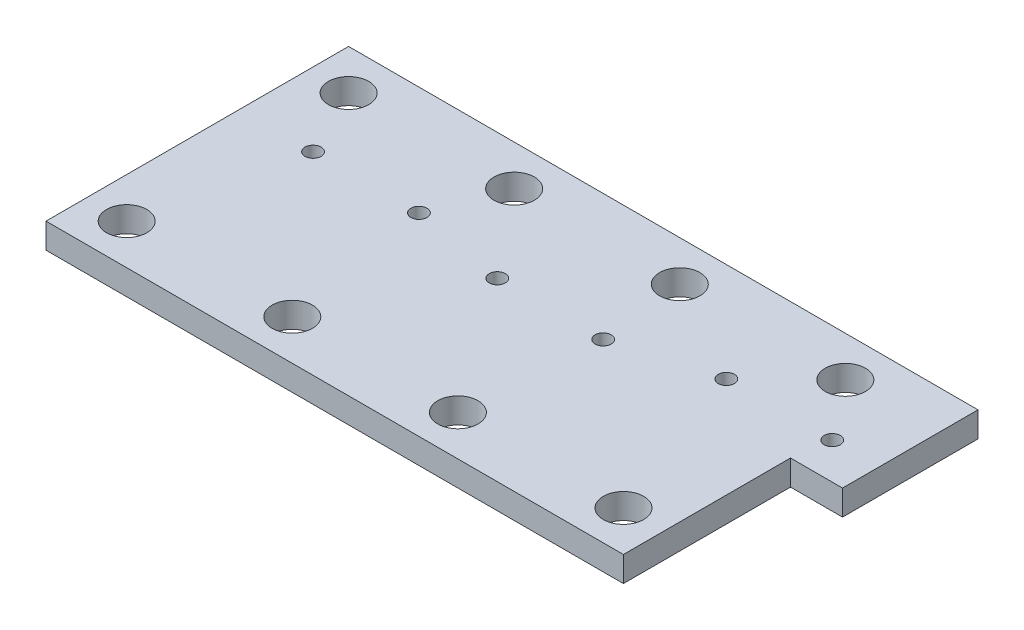
ISO-10303-21;
HEADER;
FILE_DESCRIPTION(('STEP AP214'),'2;1');
FILE_NAME('part.step','',(''),(''),'','','');
FILE_SCHEMA(('AUTOMOTIVE_DESIGN { 1 0 10303 214 1 1 1 1 }'));
ENDSEC;
DATA;
#1=APPLICATION_CONTEXT('core data for automotive mechanical design processes');
#2=APPLICATION_PROTOCOL_DEFINITION('international standard','automotive_design',2000,#1);
#3=PRODUCT_CONTEXT('',#1,'mechanical');
#4=PRODUCT('Part','Part','',(#3));
#5=PRODUCT_RELATED_PRODUCT_CATEGORY('part','',(#4));
#6=PRODUCT_DEFINITION_FORMATION('','',#4);
#7=PRODUCT_DEFINITION_CONTEXT('part definition',#1,'design');
#8=PRODUCT_DEFINITION('design','',#6,#7);
#9=PRODUCT_DEFINITION_SHAPE('','',#8);
#10=(LENGTH_UNIT() NAMED_UNIT(*) SI_UNIT(.MILLI.,.METRE.));
#11=(NAMED_UNIT(*) PLANE_ANGLE_UNIT() SI_UNIT($,.RADIAN.));
#12=(NAMED_UNIT(*) SI_UNIT($,.STERADIAN.) SOLID_ANGLE_UNIT());
#13=UNCERTAINTY_MEASURE_WITH_UNIT(LENGTH_MEASURE(1.E-05),#10,'distance_accuracy_value','');
#14=(GEOMETRIC_REPRESENTATION_CONTEXT(3) GLOBAL_UNCERTAINTY_ASSIGNED_CONTEXT((#13)) GLOBAL_UNIT_ASSIGNED_CONTEXT((#10,
#11,#12)) REPRESENTATION_CONTEXT('',''));
#15=CARTESIAN_POINT('',(0.,0.,0.));
#16=DIRECTION('',(0.,0.,1.));
#17=DIRECTION('',(1.,0.,0.));
#18=AXIS2_PLACEMENT_3D('',#15,#16,#17);
#19=CARTESIAN_POINT('',(-229.,5.,60.));
#20=DIRECTION('',(1.,0.,0.));
#21=DIRECTION('',(0.,0.,-1.));
#22=AXIS2_PLACEMENT_3D('',#19,#20,#21);
#23=PLANE('',#22);
#24=DIRECTION('',(0.,0.,1.));
#25=VECTOR('',#24,1.);
#26=CARTESIAN_POINT('',(-229.,-5.,60.));
#27=LINE('',#26,#25);
#28=CARTESIAN_POINT('',(-229.,-5.,-59.9999999999999));
#29=VERTEX_POINT('',#28);
#30=CARTESIAN_POINT('',(-229.,-5.,60.));
#31=VERTEX_POINT('',#30);
#32=EDGE_CURVE('E126',#29,#31,#27,.T.);
#33=ORIENTED_EDGE('',*,*,#32,.T.);
#34=DIRECTION('',(0.,-1.,0.));
#35=VECTOR('',#34,1.);
#36=CARTESIAN_POINT('',(-229.,5.,60.));
#37=LINE('',#36,#35);
#38=CARTESIAN_POINT('',(-229.,5.,60.));
#39=VERTEX_POINT('',#38);
#40=EDGE_CURVE('E11',#39,#31,#37,.T.);
#41=ORIENTED_EDGE('',*,*,#40,.F.);
#42=DIRECTION('',(0.,0.,1.));
#43=VECTOR('',#42,1.);
#44=CARTESIAN_POINT('',(-229.,5.,60.));
#45=LINE('',#44,#43);
#46=CARTESIAN_POINT('',(-229.,5.,-59.9999999999999));
#47=VERTEX_POINT('',#46);
#48=EDGE_CURVE('E127',#47,#39,#45,.T.);
#49=ORIENTED_EDGE('',*,*,#48,.F.);
#50=DIRECTION('',(0.,-1.,0.));
#51=VECTOR('',#50,1.);
#52=CARTESIAN_POINT('',(-229.,5.,-59.9999999999999));
#53=LINE('',#52,#51);
#54=EDGE_CURVE('E134',#47,#29,#53,.T.);
#55=ORIENTED_EDGE('',*,*,#54,.T.);
#56=EDGE_LOOP('',(#33,#41,#49,#55));
#57=FACE_BOUND('',#56,.T.);
#58=ADVANCED_FACE('F41',(#57),#23,.F.);
#59=CARTESIAN_POINT('',(-229.,5.,60.));
#60=DIRECTION('',(0.,0.,-1.));
#61=DIRECTION('',(-1.,0.,0.));
#62=AXIS2_PLACEMENT_3D('',#59,#60,#61);
#63=PLANE('',#62);
#64=DIRECTION('',(1.,0.,0.));
#65=VECTOR('',#64,1.);
#66=CARTESIAN_POINT('',(-229.,-5.,60.));
#67=LINE('',#66,#65);
#68=CARTESIAN_POINT('',(0.,-5.,60.));
#69=VERTEX_POINT('',#68);
#70=EDGE_CURVE('E137',#31,#69,#67,.T.);
#71=ORIENTED_EDGE('',*,*,#70,.T.);
#72=DIRECTION('',(0.,-1.,0.));
#73=VECTOR('',#72,1.);
#74=CARTESIAN_POINT('',(0.,5.,60.));
#75=LINE('',#74,#73);
#76=CARTESIAN_POINT('',(0.,5.,60.));
#77=VERTEX_POINT('',#76);
#78=EDGE_CURVE('E48',#77,#69,#75,.T.);
#79=ORIENTED_EDGE('',*,*,#78,.F.);
#80=DIRECTION('',(1.,0.,0.));
#81=VECTOR('',#80,1.);
#82=CARTESIAN_POINT('',(-229.,5.,60.));
#83=LINE('',#82,#81);
#84=EDGE_CURVE('E87',#39,#77,#83,.T.);
#85=ORIENTED_EDGE('',*,*,#84,.F.);
#86=ORIENTED_EDGE('',*,*,#40,.T.);
#87=EDGE_LOOP('',(#71,#79,#85,#86));
#88=FACE_BOUND('',#87,.T.);
#89=ADVANCED_FACE('F147',(#88),#63,.F.);
#90=CARTESIAN_POINT('',(0.,5.,60.));
#91=DIRECTION('',(-1.,0.,0.));
#92=DIRECTION('',(0.,0.,1.));
#93=AXIS2_PLACEMENT_3D('',#90,#91,#92);
#94=PLANE('',#93);
#95=DIRECTION('',(0.,0.,-1.));
#96=VECTOR('',#95,1.);
#97=CARTESIAN_POINT('',(0.,-5.,60.));
#98=LINE('',#97,#96);
#99=CARTESIAN_POINT('',(0.,-5.,-6.26999599679678));
#100=VERTEX_POINT('',#99);
#101=EDGE_CURVE('E139',#69,#100,#98,.T.);
#102=ORIENTED_EDGE('',*,*,#101,.T.);
#103=DIRECTION('',(0.,1.,0.));
#104=VECTOR('',#103,1.);
#105=CARTESIAN_POINT('',(0.,-62.5553082723772,-6.26999599679678));
#106=LINE('',#105,#104);
#107=CARTESIAN_POINT('',(0.,5.,-6.26999599679678));
#108=VERTEX_POINT('',#107);
#109=EDGE_CURVE('E118',#100,#108,#106,.T.);
#110=ORIENTED_EDGE('',*,*,#109,.T.);
#111=DIRECTION('',(0.,0.,-1.));
#112=VECTOR('',#111,1.);
#113=CARTESIAN_POINT('',(0.,5.,60.));
#114=LINE('',#113,#112);
#115=EDGE_CURVE('E130',#77,#108,#114,.T.);
#116=ORIENTED_EDGE('',*,*,#115,.F.);
#117=ORIENTED_EDGE('',*,*,#78,.T.);
#118=EDGE_LOOP('',(#102,#110,#116,#117));
#119=FACE_BOUND('',#118,.T.);
#120=ADVANCED_FACE('F145',(#119),#94,.F.);
#121=CARTESIAN_POINT('',(-229.,5.,-59.9999999999999));
#122=DIRECTION('',(0.,0.,1.));
#123=DIRECTION('',(1.,0.,0.));
#124=AXIS2_PLACEMENT_3D('',#121,#122,#123);
#125=PLANE('',#124);
#126=DIRECTION('',(-1.,0.,0.));
#127=VECTOR('',#126,1.);
#128=CARTESIAN_POINT('',(-229.,-5.,-59.9999999999999));
#129=LINE('',#128,#127);
#130=CARTESIAN_POINT('',(20.6325030024023,-5.,-60.));
#131=VERTEX_POINT('',#130);
#132=EDGE_CURVE('E82',#131,#29,#129,.T.);
#133=ORIENTED_EDGE('',*,*,#132,.T.);
#134=ORIENTED_EDGE('',*,*,#54,.F.);
#135=DIRECTION('',(-1.,0.,0.));
#136=VECTOR('',#135,1.);
#137=CARTESIAN_POINT('',(-229.,5.,-59.9999999999999));
#138=LINE('',#137,#136);
#139=CARTESIAN_POINT('',(20.6325030024023,5.,-60.));
#140=VERTEX_POINT('',#139);
#141=EDGE_CURVE('E64',#140,#47,#138,.T.);
#142=ORIENTED_EDGE('',*,*,#141,.F.);
#143=DIRECTION('',(0.,1.,0.));
#144=VECTOR('',#143,1.);
#145=CARTESIAN_POINT('',(20.6325030024023,-62.5553082723772,-60.));
#146=LINE('',#145,#144);
#147=EDGE_CURVE('E110',#131,#140,#146,.T.);
#148=ORIENTED_EDGE('',*,*,#147,.F.);
#149=EDGE_LOOP('',(#133,#134,#142,#148));
#150=FACE_BOUND('',#149,.T.);
#151=ADVANCED_FACE('F150',(#150),#125,.F.);
#152=CARTESIAN_POINT('',(0.,5.,0.));
#153=DIRECTION('',(0.,-1.,0.));
#154=DIRECTION('',(0.,0.,-1.));
#155=AXIS2_PLACEMENT_3D('',#152,#153,#154);
#156=PLANE('',#155);
#157=CARTESIAN_POINT('',(-199.875,5.,-16.78));
#158=DIRECTION('',(0.,1.,0.));
#159=DIRECTION('',(0.,0.,1.));
#160=AXIS2_PLACEMENT_3D('',#157,#158,#159);
#161=CIRCLE('',#160,3.19999999999998);
#162=CARTESIAN_POINT('',(-199.875,5.,-13.58));
#163=VERTEX_POINT('',#162);
#164=EDGE_CURVE('E236',#163,#163,#161,.T.);
#165=ORIENTED_EDGE('',*,*,#164,.F.);
#166=EDGE_LOOP('',(#165));
#167=FACE_BOUND('',#166,.T.);
#168=CARTESIAN_POINT('',(-157.875,5.,-16.78));
#169=DIRECTION('',(0.,1.,0.));
#170=DIRECTION('',(0.,0.,1.));
#171=AXIS2_PLACEMENT_3D('',#168,#169,#170);
#172=CIRCLE('',#171,3.19999999999998);
#173=CARTESIAN_POINT('',(-157.875,5.,-13.58));
#174=VERTEX_POINT('',#173);
#175=EDGE_CURVE('E230',#174,#174,#172,.T.);
#176=ORIENTED_EDGE('',*,*,#175,.F.);
#177=EDGE_LOOP('',(#176));
#178=FACE_BOUND('',#177,.T.);
#179=CARTESIAN_POINT('',(-119.875,5.,-9.85236608301415));
#180=DIRECTION('',(0.,1.,0.));
#181=DIRECTION('',(0.,0.,1.));
#182=AXIS2_PLACEMENT_3D('',#179,#180,#181);
#183=CIRCLE('',#182,3.19999999999998);
#184=CARTESIAN_POINT('',(-119.875,5.,-6.65236608301417));
#185=VERTEX_POINT('',#184);
#186=EDGE_CURVE('E224',#185,#185,#183,.T.);
#187=ORIENTED_EDGE('',*,*,#186,.F.);
#188=EDGE_LOOP('',(#187));
#189=FACE_BOUND('',#188,.T.);
#190=CARTESIAN_POINT('',(-77.875,5.,-9.85236608301415));
#191=DIRECTION('',(0.,1.,0.));
#192=DIRECTION('',(0.,0.,1.));
#193=AXIS2_PLACEMENT_3D('',#190,#191,#192);
#194=CIRCLE('',#193,3.19999999999998);
#195=CARTESIAN_POINT('',(-77.875,5.,-6.65236608301417));
#196=VERTEX_POINT('',#195);
#197=EDGE_CURVE('E218',#196,#196,#194,.T.);
#198=ORIENTED_EDGE('',*,*,#197,.F.);
#199=EDGE_LOOP('',(#198));
#200=FACE_BOUND('',#199,.T.);
#201=CARTESIAN_POINT('',(-39.875,5.,-20.69101));
#202=DIRECTION('',(0.,1.,0.));
#203=DIRECTION('',(0.,0.,1.));
#204=AXIS2_PLACEMENT_3D('',#201,#202,#203);
#205=CIRCLE('',#204,3.19999999999999);
#206=CARTESIAN_POINT('',(-39.875,5.,-17.49101));
#207=VERTEX_POINT('',#206);
#208=EDGE_CURVE('E212',#207,#207,#205,.T.);
#209=ORIENTED_EDGE('',*,*,#208,.F.);
#210=EDGE_LOOP('',(#209));
#211=FACE_BOUND('',#210,.T.);
#212=CARTESIAN_POINT('',(2.12500000000005,5.,-20.69101));
#213=DIRECTION('',(0.,1.,0.));
#214=DIRECTION('',(0.,0.,1.));
#215=AXIS2_PLACEMENT_3D('',#212,#213,#214);
#216=CIRCLE('',#215,3.19999999999999);
#217=CARTESIAN_POINT('',(2.12500000000005,5.,-17.49101));
#218=VERTEX_POINT('',#217);
#219=EDGE_CURVE('E206',#218,#218,#216,.T.);
#220=ORIENTED_EDGE('',*,*,#219,.F.);
#221=EDGE_LOOP('',(#220));
#222=FACE_BOUND('',#221,.T.);
#223=CARTESIAN_POINT('',(-213.,5.,-44.));
#224=DIRECTION('',(0.,1.,0.));
#225=DIRECTION('',(0.,0.,1.));
#226=AXIS2_PLACEMENT_3D('',#223,#224,#225);
#227=CIRCLE('',#226,8.00000000000001);
#228=CARTESIAN_POINT('',(-213.,5.,-36.));
#229=VERTEX_POINT('',#228);
#230=EDGE_CURVE('E200',#229,#229,#227,.T.);
#231=ORIENTED_EDGE('',*,*,#230,.F.);
#232=EDGE_LOOP('',(#231));
#233=FACE_BOUND('',#232,.T.);
#234=CARTESIAN_POINT('',(-147.323,5.,-44.));
#235=DIRECTION('',(0.,1.,0.));
#236=DIRECTION('',(0.,0.,1.));
#237=AXIS2_PLACEMENT_3D('',#234,#235,#236);
#238=CIRCLE('',#237,8.00000000000001);
#239=CARTESIAN_POINT('',(-147.323,5.,-36.));
#240=VERTEX_POINT('',#239);
#241=EDGE_CURVE('E194',#240,#240,#238,.T.);
#242=ORIENTED_EDGE('',*,*,#241,.F.);
#243=EDGE_LOOP('',(#242));
#244=FACE_BOUND('',#243,.T.);
#245=CARTESIAN_POINT('',(-81.6460000000001,5.,-44.));
#246=DIRECTION('',(0.,1.,0.));
#247=DIRECTION('',(0.,0.,1.));
#248=AXIS2_PLACEMENT_3D('',#245,#246,#247);
#249=CIRCLE('',#248,7.99999999999999);
#250=CARTESIAN_POINT('',(-81.6460000000001,5.,-36.));
#251=VERTEX_POINT('',#250);
#252=EDGE_CURVE('E188',#251,#251,#249,.T.);
#253=ORIENTED_EDGE('',*,*,#252,.F.);
#254=EDGE_LOOP('',(#253));
#255=FACE_BOUND('',#254,.T.);
#256=CARTESIAN_POINT('',(-15.969,5.,-44.));
#257=DIRECTION('',(0.,1.,0.));
#258=DIRECTION('',(0.,0.,1.));
#259=AXIS2_PLACEMENT_3D('',#256,#257,#258);
#260=CIRCLE('',#259,8.);
#261=CARTESIAN_POINT('',(-15.969,5.,-36.));
#262=VERTEX_POINT('',#261);
#263=EDGE_CURVE('E182',#262,#262,#260,.T.);
#264=ORIENTED_EDGE('',*,*,#263,.F.);
#265=EDGE_LOOP('',(#264));
#266=FACE_BOUND('',#265,.T.);
#267=CARTESIAN_POINT('',(-213.,5.,44.));
#268=DIRECTION('',(0.,1.,0.));
#269=DIRECTION('',(0.,0.,1.));
#270=AXIS2_PLACEMENT_3D('',#267,#268,#269);
#271=CIRCLE('',#270,8.00000000000001);
#272=CARTESIAN_POINT('',(-213.,5.,52.));
#273=VERTEX_POINT('',#272);
#274=EDGE_CURVE('E176',#273,#273,#271,.T.);
#275=ORIENTED_EDGE('',*,*,#274,.F.);
#276=EDGE_LOOP('',(#275));
#277=FACE_BOUND('',#276,.T.);
#278=CARTESIAN_POINT('',(-147.323,5.,44.));
#279=DIRECTION('',(0.,1.,0.));
#280=DIRECTION('',(0.,0.,1.));
#281=AXIS2_PLACEMENT_3D('',#278,#279,#280);
#282=CIRCLE('',#281,8.00000000000001);
#283=CARTESIAN_POINT('',(-147.323,5.,52.));
#284=VERTEX_POINT('',#283);
#285=EDGE_CURVE('E170',#284,#284,#282,.T.);
#286=ORIENTED_EDGE('',*,*,#285,.F.);
#287=EDGE_LOOP('',(#286));
#288=FACE_BOUND('',#287,.T.);
#289=CARTESIAN_POINT('',(-81.6460000000001,5.,44.));
#290=DIRECTION('',(0.,1.,0.));
#291=DIRECTION('',(0.,0.,1.));
#292=AXIS2_PLACEMENT_3D('',#289,#290,#291);
#293=CIRCLE('',#292,7.99999999999999);
#294=CARTESIAN_POINT('',(-81.6460000000001,5.,52.));
#295=VERTEX_POINT('',#294);
#296=EDGE_CURVE('E164',#295,#295,#293,.T.);
#297=ORIENTED_EDGE('',*,*,#296,.F.);
#298=EDGE_LOOP('',(#297));
#299=FACE_BOUND('',#298,.T.);
#300=CARTESIAN_POINT('',(-15.969,5.,44.));
#301=DIRECTION('',(0.,1.,0.));
#302=DIRECTION('',(0.,0.,1.));
#303=AXIS2_PLACEMENT_3D('',#300,#301,#302);
#304=CIRCLE('',#303,8.);
#305=CARTESIAN_POINT('',(-15.969,5.,52.));
#306=VERTEX_POINT('',#305);
#307=EDGE_CURVE('E154',#306,#306,#304,.T.);
#308=ORIENTED_EDGE('',*,*,#307,.F.);
#309=EDGE_LOOP('',(#308));
#310=FACE_BOUND('',#309,.T.);
#311=ORIENTED_EDGE('',*,*,#48,.T.);
#312=ORIENTED_EDGE('',*,*,#84,.T.);
#313=ORIENTED_EDGE('',*,*,#115,.T.);
#314=DIRECTION('',(1.,0.,0.));
#315=VECTOR('',#314,1.);
#316=CARTESIAN_POINT('',(0.,5.,-6.26999599679678));
#317=LINE('',#316,#315);
#318=CARTESIAN_POINT('',(20.6325030024023,5.,-6.26999599679678));
#319=VERTEX_POINT('',#318);
#320=EDGE_CURVE('E55',#108,#319,#317,.T.);
#321=ORIENTED_EDGE('',*,*,#320,.T.);
#322=DIRECTION('',(0.,0.,-1.));
#323=VECTOR('',#322,1.);
#324=CARTESIAN_POINT('',(20.6325030024023,5.,-60.));
#325=LINE('',#324,#323);
#326=EDGE_CURVE('E115',#319,#140,#325,.T.);
#327=ORIENTED_EDGE('',*,*,#326,.T.);
#328=ORIENTED_EDGE('',*,*,#141,.T.);
#329=EDGE_LOOP('',(#311,#312,#313,#321,#327,#328));
#330=FACE_BOUND('',#329,.T.);
#331=ADVANCED_FACE('F151',(#167,#178,#189,#200,#211,#222,#233,#244,#255,#266,#277,#288,#299,
#310,#330),#156,.F.);
#332=CARTESIAN_POINT('',(0.,-5.,0.));
#333=DIRECTION('',(0.,-1.,0.));
#334=DIRECTION('',(0.,0.,-1.));
#335=AXIS2_PLACEMENT_3D('',#332,#333,#334);
#336=PLANE('',#335);
#337=CARTESIAN_POINT('',(-199.875,-5.,-16.78));
#338=DIRECTION('',(0.,1.,0.));
#339=DIRECTION('',(0.,0.,1.));
#340=AXIS2_PLACEMENT_3D('',#337,#338,#339);
#341=CIRCLE('',#340,3.20000000000001);
#342=CARTESIAN_POINT('',(-199.875,-5.,-13.58));
#343=VERTEX_POINT('',#342);
#344=EDGE_CURVE('E233',#343,#343,#341,.T.);
#345=ORIENTED_EDGE('',*,*,#344,.T.);
#346=EDGE_LOOP('',(#345));
#347=FACE_BOUND('',#346,.T.);
#348=CARTESIAN_POINT('',(-157.875,-5.,-16.78));
#349=DIRECTION('',(0.,1.,0.));
#350=DIRECTION('',(0.,0.,1.));
#351=AXIS2_PLACEMENT_3D('',#348,#349,#350);
#352=CIRCLE('',#351,3.20000000000001);
#353=CARTESIAN_POINT('',(-157.875,-5.,-13.58));
#354=VERTEX_POINT('',#353);
#355=EDGE_CURVE('E227',#354,#354,#352,.T.);
#356=ORIENTED_EDGE('',*,*,#355,.T.);
#357=EDGE_LOOP('',(#356));
#358=FACE_BOUND('',#357,.T.);
#359=CARTESIAN_POINT('',(-119.875,-5.,-9.85236608301415));
#360=DIRECTION('',(0.,1.,0.));
#361=DIRECTION('',(0.,0.,1.));
#362=AXIS2_PLACEMENT_3D('',#359,#360,#361);
#363=CIRCLE('',#362,3.19999999999999);
#364=CARTESIAN_POINT('',(-119.875,-5.,-6.65236608301415));
#365=VERTEX_POINT('',#364);
#366=EDGE_CURVE('E221',#365,#365,#363,.T.);
#367=ORIENTED_EDGE('',*,*,#366,.T.);
#368=EDGE_LOOP('',(#367));
#369=FACE_BOUND('',#368,.T.);
#370=CARTESIAN_POINT('',(-77.875,-5.,-9.85236608301415));
#371=DIRECTION('',(0.,1.,0.));
#372=DIRECTION('',(0.,0.,1.));
#373=AXIS2_PLACEMENT_3D('',#370,#371,#372);
#374=CIRCLE('',#373,3.19999999999999);
#375=CARTESIAN_POINT('',(-77.875,-5.,-6.65236608301415));
#376=VERTEX_POINT('',#375);
#377=EDGE_CURVE('E215',#376,#376,#374,.T.);
#378=ORIENTED_EDGE('',*,*,#377,.T.);
#379=EDGE_LOOP('',(#378));
#380=FACE_BOUND('',#379,.T.);
#381=CARTESIAN_POINT('',(-39.875,-5.,-20.69101));
#382=DIRECTION('',(0.,1.,0.));
#383=DIRECTION('',(0.,0.,1.));
#384=AXIS2_PLACEMENT_3D('',#381,#382,#383);
#385=CIRCLE('',#384,3.19999999999999);
#386=CARTESIAN_POINT('',(-39.875,-5.,-17.49101));
#387=VERTEX_POINT('',#386);
#388=EDGE_CURVE('E209',#387,#387,#385,.T.);
#389=ORIENTED_EDGE('',*,*,#388,.T.);
#390=EDGE_LOOP('',(#389));
#391=FACE_BOUND('',#390,.T.);
#392=CARTESIAN_POINT('',(2.12500000000005,-5.,-20.69101));
#393=DIRECTION('',(0.,1.,0.));
#394=DIRECTION('',(0.,0.,1.));
#395=AXIS2_PLACEMENT_3D('',#392,#393,#394);
#396=CIRCLE('',#395,3.2);
#397=CARTESIAN_POINT('',(2.12500000000005,-5.,-17.49101));
#398=VERTEX_POINT('',#397);
#399=EDGE_CURVE('E203',#398,#398,#396,.T.);
#400=ORIENTED_EDGE('',*,*,#399,.T.);
#401=EDGE_LOOP('',(#400));
#402=FACE_BOUND('',#401,.T.);
#403=CARTESIAN_POINT('',(-213.,-5.,-44.));
#404=DIRECTION('',(0.,1.,0.));
#405=DIRECTION('',(0.,0.,1.));
#406=AXIS2_PLACEMENT_3D('',#403,#404,#405);
#407=CIRCLE('',#406,8.00000000000001);
#408=CARTESIAN_POINT('',(-213.,-5.,-36.));
#409=VERTEX_POINT('',#408);
#410=EDGE_CURVE('E197',#409,#409,#407,.T.);
#411=ORIENTED_EDGE('',*,*,#410,.T.);
#412=EDGE_LOOP('',(#411));
#413=FACE_BOUND('',#412,.T.);
#414=CARTESIAN_POINT('',(-147.323,-5.,-44.));
#415=DIRECTION('',(0.,1.,0.));
#416=DIRECTION('',(0.,0.,1.));
#417=AXIS2_PLACEMENT_3D('',#414,#415,#416);
#418=CIRCLE('',#417,8.00000000000001);
#419=CARTESIAN_POINT('',(-147.323,-5.,-36.));
#420=VERTEX_POINT('',#419);
#421=EDGE_CURVE('E191',#420,#420,#418,.T.);
#422=ORIENTED_EDGE('',*,*,#421,.T.);
#423=EDGE_LOOP('',(#422));
#424=FACE_BOUND('',#423,.T.);
#425=CARTESIAN_POINT('',(-81.6460000000001,-5.,-44.));
#426=DIRECTION('',(0.,1.,0.));
#427=DIRECTION('',(0.,0.,1.));
#428=AXIS2_PLACEMENT_3D('',#425,#426,#427);
#429=CIRCLE('',#428,7.99999999999999);
#430=CARTESIAN_POINT('',(-81.6460000000001,-5.,-36.));
#431=VERTEX_POINT('',#430);
#432=EDGE_CURVE('E185',#431,#431,#429,.T.);
#433=ORIENTED_EDGE('',*,*,#432,.T.);
#434=EDGE_LOOP('',(#433));
#435=FACE_BOUND('',#434,.T.);
#436=CARTESIAN_POINT('',(-15.969,-5.,-44.));
#437=DIRECTION('',(0.,1.,0.));
#438=DIRECTION('',(0.,0.,1.));
#439=AXIS2_PLACEMENT_3D('',#436,#437,#438);
#440=CIRCLE('',#439,8.);
#441=CARTESIAN_POINT('',(-15.969,-5.,-36.));
#442=VERTEX_POINT('',#441);
#443=EDGE_CURVE('E179',#442,#442,#440,.T.);
#444=ORIENTED_EDGE('',*,*,#443,.T.);
#445=EDGE_LOOP('',(#444));
#446=FACE_BOUND('',#445,.T.);
#447=CARTESIAN_POINT('',(-213.,-5.,44.));
#448=DIRECTION('',(0.,1.,0.));
#449=DIRECTION('',(0.,0.,1.));
#450=AXIS2_PLACEMENT_3D('',#447,#448,#449);
#451=CIRCLE('',#450,8.00000000000001);
#452=CARTESIAN_POINT('',(-213.,-5.,52.));
#453=VERTEX_POINT('',#452);
#454=EDGE_CURVE('E173',#453,#453,#451,.T.);
#455=ORIENTED_EDGE('',*,*,#454,.T.);
#456=EDGE_LOOP('',(#455));
#457=FACE_BOUND('',#456,.T.);
#458=CARTESIAN_POINT('',(-147.323,-5.,44.));
#459=DIRECTION('',(0.,1.,0.));
#460=DIRECTION('',(0.,0.,1.));
#461=AXIS2_PLACEMENT_3D('',#458,#459,#460);
#462=CIRCLE('',#461,8.00000000000001);
#463=CARTESIAN_POINT('',(-147.323,-5.,52.));
#464=VERTEX_POINT('',#463);
#465=EDGE_CURVE('E167',#464,#464,#462,.T.);
#466=ORIENTED_EDGE('',*,*,#465,.T.);
#467=EDGE_LOOP('',(#466));
#468=FACE_BOUND('',#467,.T.);
#469=CARTESIAN_POINT('',(-81.6460000000001,-5.,44.));
#470=DIRECTION('',(0.,1.,0.));
#471=DIRECTION('',(0.,0.,1.));
#472=AXIS2_PLACEMENT_3D('',#469,#470,#471);
#473=CIRCLE('',#472,7.99999999999999);
#474=CARTESIAN_POINT('',(-81.6460000000001,-5.,52.));
#475=VERTEX_POINT('',#474);
#476=EDGE_CURVE('E159',#475,#475,#473,.T.);
#477=ORIENTED_EDGE('',*,*,#476,.T.);
#478=EDGE_LOOP('',(#477));
#479=FACE_BOUND('',#478,.T.);
#480=CARTESIAN_POINT('',(-15.969,-5.,44.));
#481=DIRECTION('',(0.,1.,0.));
#482=DIRECTION('',(0.,0.,1.));
#483=AXIS2_PLACEMENT_3D('',#480,#481,#482);
#484=CIRCLE('',#483,8.);
#485=CARTESIAN_POINT('',(-15.969,-5.,52.));
#486=VERTEX_POINT('',#485);
#487=EDGE_CURVE('E152',#486,#486,#484,.T.);
#488=ORIENTED_EDGE('',*,*,#487,.T.);
#489=EDGE_LOOP('',(#488));
#490=FACE_BOUND('',#489,.T.);
#491=ORIENTED_EDGE('',*,*,#32,.F.);
#492=ORIENTED_EDGE('',*,*,#132,.F.);
#493=DIRECTION('',(0.,0.,-1.));
#494=VECTOR('',#493,1.);
#495=CARTESIAN_POINT('',(20.6325030024023,-5.,-60.));
#496=LINE('',#495,#494);
#497=CARTESIAN_POINT('',(20.6325030024023,-5.,-6.26999599679678));
#498=VERTEX_POINT('',#497);
#499=EDGE_CURVE('E101',#498,#131,#496,.T.);
#500=ORIENTED_EDGE('',*,*,#499,.F.);
#501=DIRECTION('',(1.,0.,0.));
#502=VECTOR('',#501,1.);
#503=CARTESIAN_POINT('',(0.,-5.,-6.26999599679678));
#504=LINE('',#503,#502);
#505=EDGE_CURVE('E107',#100,#498,#504,.T.);
#506=ORIENTED_EDGE('',*,*,#505,.F.);
#507=ORIENTED_EDGE('',*,*,#101,.F.);
#508=ORIENTED_EDGE('',*,*,#70,.F.);
#509=EDGE_LOOP('',(#491,#492,#500,#506,#507,#508));
#510=FACE_BOUND('',#509,.T.);
#511=ADVANCED_FACE('F104',(#347,#358,#369,#380,#391,#402,#413,#424,#435,#446,#457,#468,#479,
#490,#510),#336,.T.);
#512=CARTESIAN_POINT('',(0.,-62.5553082723772,-6.26999599679678));
#513=DIRECTION('',(0.,0.,1.));
#514=DIRECTION('',(1.,0.,0.));
#515=AXIS2_PLACEMENT_3D('',#512,#513,#514);
#516=PLANE('',#515);
#517=ORIENTED_EDGE('',*,*,#109,.F.);
#518=ORIENTED_EDGE('',*,*,#505,.T.);
#519=DIRECTION('',(0.,1.,0.));
#520=VECTOR('',#519,1.);
#521=CARTESIAN_POINT('',(20.6325030024023,-62.5553082723772,-6.26999599679678));
#522=LINE('',#521,#520);
#523=EDGE_CURVE('E111',#498,#319,#522,.T.);
#524=ORIENTED_EDGE('',*,*,#523,.T.);
#525=ORIENTED_EDGE('',*,*,#320,.F.);
#526=EDGE_LOOP('',(#517,#518,#524,#525));
#527=FACE_BOUND('',#526,.T.);
#528=ADVANCED_FACE('F117',(#527),#516,.T.);
#529=CARTESIAN_POINT('',(20.6325030024023,-62.5553082723772,-60.));
#530=DIRECTION('',(1.,0.,0.));
#531=DIRECTION('',(0.,0.,-1.));
#532=AXIS2_PLACEMENT_3D('',#529,#530,#531);
#533=PLANE('',#532);
#534=ORIENTED_EDGE('',*,*,#523,.F.);
#535=ORIENTED_EDGE('',*,*,#499,.T.);
#536=ORIENTED_EDGE('',*,*,#147,.T.);
#537=ORIENTED_EDGE('',*,*,#326,.F.);
#538=EDGE_LOOP('',(#534,#535,#536,#537));
#539=FACE_BOUND('',#538,.T.);
#540=ADVANCED_FACE('F114',(#539),#533,.T.);
#541=CARTESIAN_POINT('',(-15.969,5.,44.));
#542=DIRECTION('',(0.,1.,0.));
#543=DIRECTION('',(0.,0.,1.));
#544=AXIS2_PLACEMENT_3D('',#541,#542,#543);
#545=CYLINDRICAL_SURFACE('',#544,8.);
#546=ORIENTED_EDGE('',*,*,#487,.F.);
#547=EDGE_LOOP('',(#546));
#548=FACE_BOUND('',#547,.T.);
#549=ORIENTED_EDGE('',*,*,#307,.T.);
#550=EDGE_LOOP('',(#549));
#551=FACE_BOUND('',#550,.T.);
#552=ADVANCED_FACE('F271',(#548,#551),#545,.F.);
#553=CARTESIAN_POINT('',(-81.6460000000001,5.,44.));
#554=DIRECTION('',(0.,1.,0.));
#555=DIRECTION('',(0.,0.,1.));
#556=AXIS2_PLACEMENT_3D('',#553,#554,#555);
#557=CYLINDRICAL_SURFACE('',#556,7.99999999999999);
#558=ORIENTED_EDGE('',*,*,#476,.F.);
#559=EDGE_LOOP('',(#558));
#560=FACE_BOUND('',#559,.T.);
#561=ORIENTED_EDGE('',*,*,#296,.T.);
#562=EDGE_LOOP('',(#561));
#563=FACE_BOUND('',#562,.T.);
#564=ADVANCED_FACE('F273',(#560,#563),#557,.F.);
#565=CARTESIAN_POINT('',(-147.323,5.,44.));
#566=DIRECTION('',(0.,1.,0.));
#567=DIRECTION('',(0.,0.,1.));
#568=AXIS2_PLACEMENT_3D('',#565,#566,#567);
#569=CYLINDRICAL_SURFACE('',#568,8.00000000000001);
#570=ORIENTED_EDGE('',*,*,#465,.F.);
#571=EDGE_LOOP('',(#570));
#572=FACE_BOUND('',#571,.T.);
#573=ORIENTED_EDGE('',*,*,#285,.T.);
#574=EDGE_LOOP('',(#573));
#575=FACE_BOUND('',#574,.T.);
#576=ADVANCED_FACE('F280',(#572,#575),#569,.F.);
#577=CARTESIAN_POINT('',(-213.,5.,44.));
#578=DIRECTION('',(0.,1.,0.));
#579=DIRECTION('',(0.,0.,1.));
#580=AXIS2_PLACEMENT_3D('',#577,#578,#579);
#581=CYLINDRICAL_SURFACE('',#580,8.00000000000001);
#582=ORIENTED_EDGE('',*,*,#454,.F.);
#583=EDGE_LOOP('',(#582));
#584=FACE_BOUND('',#583,.T.);
#585=ORIENTED_EDGE('',*,*,#274,.T.);
#586=EDGE_LOOP('',(#585));
#587=FACE_BOUND('',#586,.T.);
#588=ADVANCED_FACE('F329',(#584,#587),#581,.F.);
#589=CARTESIAN_POINT('',(-15.969,5.,-44.));
#590=DIRECTION('',(0.,1.,0.));
#591=DIRECTION('',(0.,0.,1.));
#592=AXIS2_PLACEMENT_3D('',#589,#590,#591);
#593=CYLINDRICAL_SURFACE('',#592,8.);
#594=ORIENTED_EDGE('',*,*,#443,.F.);
#595=EDGE_LOOP('',(#594));
#596=FACE_BOUND('',#595,.T.);
#597=ORIENTED_EDGE('',*,*,#263,.T.);
#598=EDGE_LOOP('',(#597));
#599=FACE_BOUND('',#598,.T.);
#600=ADVANCED_FACE('F339',(#596,#599),#593,.F.);
#601=CARTESIAN_POINT('',(-81.6460000000001,5.,-44.));
#602=DIRECTION('',(0.,1.,0.));
#603=DIRECTION('',(0.,0.,1.));
#604=AXIS2_PLACEMENT_3D('',#601,#602,#603);
#605=CYLINDRICAL_SURFACE('',#604,7.99999999999999);
#606=ORIENTED_EDGE('',*,*,#432,.F.);
#607=EDGE_LOOP('',(#606));
#608=FACE_BOUND('',#607,.T.);
#609=ORIENTED_EDGE('',*,*,#252,.T.);
#610=EDGE_LOOP('',(#609));
#611=FACE_BOUND('',#610,.T.);
#612=ADVANCED_FACE('F349',(#608,#611),#605,.F.);
#613=CARTESIAN_POINT('',(-147.323,5.,-44.));
#614=DIRECTION('',(0.,1.,0.));
#615=DIRECTION('',(0.,0.,1.));
#616=AXIS2_PLACEMENT_3D('',#613,#614,#615);
#617=CYLINDRICAL_SURFACE('',#616,8.00000000000001);
#618=ORIENTED_EDGE('',*,*,#421,.F.);
#619=EDGE_LOOP('',(#618));
#620=FACE_BOUND('',#619,.T.);
#621=ORIENTED_EDGE('',*,*,#241,.T.);
#622=EDGE_LOOP('',(#621));
#623=FACE_BOUND('',#622,.T.);
#624=ADVANCED_FACE('F359',(#620,#623),#617,.F.);
#625=CARTESIAN_POINT('',(-213.,5.,-44.));
#626=DIRECTION('',(0.,1.,0.));
#627=DIRECTION('',(0.,0.,1.));
#628=AXIS2_PLACEMENT_3D('',#625,#626,#627);
#629=CYLINDRICAL_SURFACE('',#628,8.00000000000001);
#630=ORIENTED_EDGE('',*,*,#410,.F.);
#631=EDGE_LOOP('',(#630));
#632=FACE_BOUND('',#631,.T.);
#633=ORIENTED_EDGE('',*,*,#230,.T.);
#634=EDGE_LOOP('',(#633));
#635=FACE_BOUND('',#634,.T.);
#636=ADVANCED_FACE('F369',(#632,#635),#629,.F.);
#637=CARTESIAN_POINT('',(2.12500000000005,5.,-20.69101));
#638=DIRECTION('',(0.,1.,0.));
#639=DIRECTION('',(0.,0.,1.));
#640=AXIS2_PLACEMENT_3D('',#637,#638,#639);
#641=CYLINDRICAL_SURFACE('',#640,3.19999999999999);
#642=ORIENTED_EDGE('',*,*,#399,.F.);
#643=EDGE_LOOP('',(#642));
#644=FACE_BOUND('',#643,.T.);
#645=ORIENTED_EDGE('',*,*,#219,.T.);
#646=EDGE_LOOP('',(#645));
#647=FACE_BOUND('',#646,.T.);
#648=ADVANCED_FACE('F379',(#644,#647),#641,.F.);
#649=CARTESIAN_POINT('',(-39.875,5.,-20.69101));
#650=DIRECTION('',(0.,1.,0.));
#651=DIRECTION('',(0.,0.,1.));
#652=AXIS2_PLACEMENT_3D('',#649,#650,#651);
#653=CYLINDRICAL_SURFACE('',#652,3.19999999999999);
#654=ORIENTED_EDGE('',*,*,#388,.F.);
#655=EDGE_LOOP('',(#654));
#656=FACE_BOUND('',#655,.T.);
#657=ORIENTED_EDGE('',*,*,#208,.T.);
#658=EDGE_LOOP('',(#657));
#659=FACE_BOUND('',#658,.T.);
#660=ADVANCED_FACE('F389',(#656,#659),#653,.F.);
#661=CARTESIAN_POINT('',(-77.875,5.,-9.85236608301415));
#662=DIRECTION('',(0.,1.,0.));
#663=DIRECTION('',(0.,0.,1.));
#664=AXIS2_PLACEMENT_3D('',#661,#662,#663);
#665=CYLINDRICAL_SURFACE('',#664,3.19999999999999);
#666=ORIENTED_EDGE('',*,*,#377,.F.);
#667=EDGE_LOOP('',(#666));
#668=FACE_BOUND('',#667,.T.);
#669=ORIENTED_EDGE('',*,*,#197,.T.);
#670=EDGE_LOOP('',(#669));
#671=FACE_BOUND('',#670,.T.);
#672=ADVANCED_FACE('F399',(#668,#671),#665,.F.);
#673=CARTESIAN_POINT('',(-119.875,5.,-9.85236608301415));
#674=DIRECTION('',(0.,1.,0.));
#675=DIRECTION('',(0.,0.,1.));
#676=AXIS2_PLACEMENT_3D('',#673,#674,#675);
#677=CYLINDRICAL_SURFACE('',#676,3.19999999999999);
#678=ORIENTED_EDGE('',*,*,#366,.F.);
#679=EDGE_LOOP('',(#678));
#680=FACE_BOUND('',#679,.T.);
#681=ORIENTED_EDGE('',*,*,#186,.T.);
#682=EDGE_LOOP('',(#681));
#683=FACE_BOUND('',#682,.T.);
#684=ADVANCED_FACE('F409',(#680,#683),#677,.F.);
#685=CARTESIAN_POINT('',(-157.875,5.,-16.78));
#686=DIRECTION('',(0.,1.,0.));
#687=DIRECTION('',(0.,0.,1.));
#688=AXIS2_PLACEMENT_3D('',#685,#686,#687);
#689=CYLINDRICAL_SURFACE('',#688,3.19999999999999);
#690=ORIENTED_EDGE('',*,*,#355,.F.);
#691=EDGE_LOOP('',(#690));
#692=FACE_BOUND('',#691,.T.);
#693=ORIENTED_EDGE('',*,*,#175,.T.);
#694=EDGE_LOOP('',(#693));
#695=FACE_BOUND('',#694,.T.);
#696=ADVANCED_FACE('F419',(#692,#695),#689,.F.);
#697=CARTESIAN_POINT('',(-199.875,5.,-16.78));
#698=DIRECTION('',(0.,1.,0.));
#699=DIRECTION('',(0.,0.,1.));
#700=AXIS2_PLACEMENT_3D('',#697,#698,#699);
#701=CYLINDRICAL_SURFACE('',#700,3.19999999999999);
#702=ORIENTED_EDGE('',*,*,#344,.F.);
#703=EDGE_LOOP('',(#702));
#704=FACE_BOUND('',#703,.T.);
#705=ORIENTED_EDGE('',*,*,#164,.T.);
#706=EDGE_LOOP('',(#705));
#707=FACE_BOUND('',#706,.T.);
#708=ADVANCED_FACE('F240',(#704,#707),#701,.F.);
#709=CLOSED_SHELL('',(#58,#89,#120,#151,#331,#511,#528,#540,#552,#564,#576,#588,#600,#612,#624,
#636,#648,#660,#672,#684,#696,#708));
#710=MANIFOLD_SOLID_BREP('B2',#709);
#711=ADVANCED_BREP_SHAPE_REPRESENTATION('',(#18,#710),#14);
#712=SHAPE_DEFINITION_REPRESENTATION(#9,#711);
ENDSEC;
END-ISO-10303-21;
